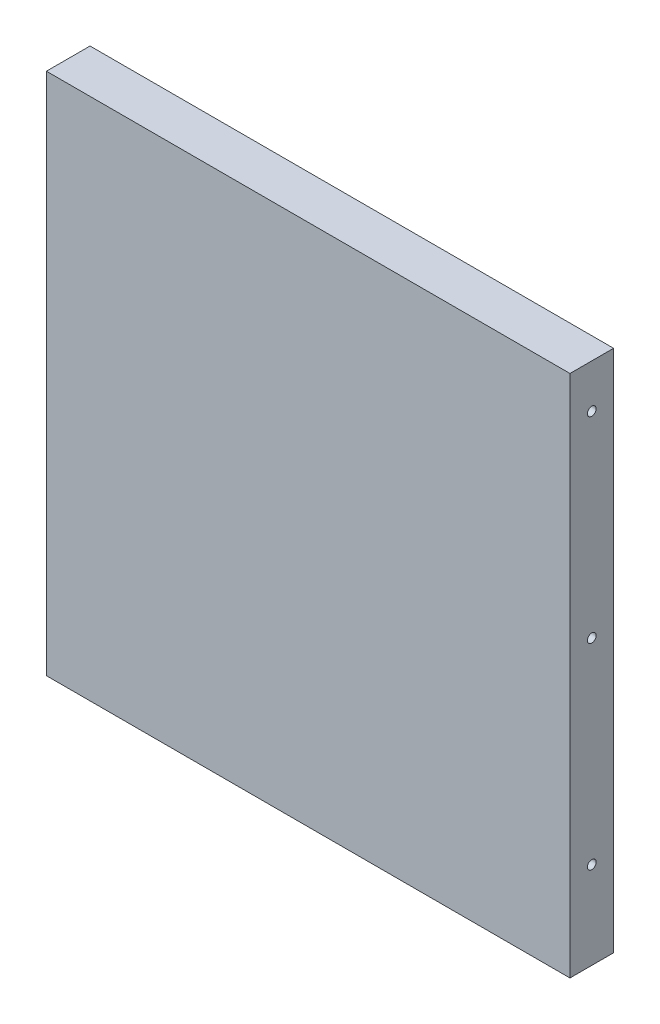
ISO-10303-21;
HEADER;
FILE_DESCRIPTION(('STEP AP214'),'2;1');
FILE_NAME('part.step','',(''),(''),'','','');
FILE_SCHEMA(('AUTOMOTIVE_DESIGN { 1 0 10303 214 1 1 1 1 }'));
ENDSEC;
DATA;
#1=APPLICATION_CONTEXT('core data for automotive mechanical design processes');
#2=APPLICATION_PROTOCOL_DEFINITION('international standard','automotive_design',2000,#1);
#3=PRODUCT_CONTEXT('',#1,'mechanical');
#4=PRODUCT('Part','Part','',(#3));
#5=PRODUCT_RELATED_PRODUCT_CATEGORY('part','',(#4));
#6=PRODUCT_DEFINITION_FORMATION('','',#4);
#7=PRODUCT_DEFINITION_CONTEXT('part definition',#1,'design');
#8=PRODUCT_DEFINITION('design','',#6,#7);
#9=PRODUCT_DEFINITION_SHAPE('','',#8);
#10=(LENGTH_UNIT() NAMED_UNIT(*) SI_UNIT(.MILLI.,.METRE.));
#11=(NAMED_UNIT(*) PLANE_ANGLE_UNIT() SI_UNIT($,.RADIAN.));
#12=(NAMED_UNIT(*) SI_UNIT($,.STERADIAN.) SOLID_ANGLE_UNIT());
#13=UNCERTAINTY_MEASURE_WITH_UNIT(LENGTH_MEASURE(1.E-05),#10,'distance_accuracy_value','');
#14=(GEOMETRIC_REPRESENTATION_CONTEXT(3) GLOBAL_UNCERTAINTY_ASSIGNED_CONTEXT((#13)) GLOBAL_UNIT_ASSIGNED_CONTEXT((#10,
#11,#12)) REPRESENTATION_CONTEXT('',''));
#15=CARTESIAN_POINT('',(0.,0.,0.));
#16=DIRECTION('',(0.,0.,1.));
#17=DIRECTION('',(1.,0.,0.));
#18=AXIS2_PLACEMENT_3D('',#15,#16,#17);
#19=CARTESIAN_POINT('',(152.4,152.4,12.7));
#20=DIRECTION('',(-1.,0.,0.));
#21=DIRECTION('',(0.,0.,1.));
#22=AXIS2_PLACEMENT_3D('',#19,#20,#21);
#23=PLANE('',#22);
#24=CARTESIAN_POINT('',(152.4,127.,0.));
#25=DIRECTION('',(1.,0.,0.));
#26=DIRECTION('',(0.,0.,-1.));
#27=AXIS2_PLACEMENT_3D('',#24,#25,#26);
#28=CIRCLE('',#27,2.55269999999999);
#29=CARTESIAN_POINT('',(152.4,127.,-2.55269999999996));
#30=VERTEX_POINT('',#29);
#31=EDGE_CURVE('E142',#30,#30,#28,.T.);
#32=ORIENTED_EDGE('',*,*,#31,.F.);
#33=EDGE_LOOP('',(#32));
#34=FACE_BOUND('',#33,.T.);
#35=CARTESIAN_POINT('',(152.4,12.7,0.));
#36=DIRECTION('',(1.,0.,0.));
#37=DIRECTION('',(0.,0.,-1.));
#38=AXIS2_PLACEMENT_3D('',#35,#36,#37);
#39=CIRCLE('',#38,2.55269999999999);
#40=CARTESIAN_POINT('',(152.4,12.7,-2.55269999999999));
#41=VERTEX_POINT('',#40);
#42=EDGE_CURVE('E150',#41,#41,#39,.T.);
#43=ORIENTED_EDGE('',*,*,#42,.F.);
#44=EDGE_LOOP('',(#43));
#45=FACE_BOUND('',#44,.T.);
#46=CARTESIAN_POINT('',(152.4,-101.6,0.));
#47=DIRECTION('',(1.,0.,0.));
#48=DIRECTION('',(0.,0.,-1.));
#49=AXIS2_PLACEMENT_3D('',#46,#47,#48);
#50=CIRCLE('',#49,2.55269999999999);
#51=CARTESIAN_POINT('',(152.4,-101.6,-2.55269999999999));
#52=VERTEX_POINT('',#51);
#53=EDGE_CURVE('E158',#52,#52,#50,.T.);
#54=ORIENTED_EDGE('',*,*,#53,.F.);
#55=EDGE_LOOP('',(#54));
#56=FACE_BOUND('',#55,.T.);
#57=DIRECTION('',(0.,0.,-1.));
#58=VECTOR('',#57,1.);
#59=CARTESIAN_POINT('',(152.4,-152.4,12.7));
#60=LINE('',#59,#58);
#61=CARTESIAN_POINT('',(152.4,-152.4,12.7));
#62=VERTEX_POINT('',#61);
#63=CARTESIAN_POINT('',(152.4,-152.4,-12.7));
#64=VERTEX_POINT('',#63);
#65=EDGE_CURVE('E166',#62,#64,#60,.T.);
#66=ORIENTED_EDGE('',*,*,#65,.T.);
#67=DIRECTION('',(0.,-1.,0.));
#68=VECTOR('',#67,1.);
#69=CARTESIAN_POINT('',(152.4,152.4,-12.7));
#70=LINE('',#69,#68);
#71=CARTESIAN_POINT('',(152.4,152.4,-12.7));
#72=VERTEX_POINT('',#71);
#73=EDGE_CURVE('E11',#72,#64,#70,.T.);
#74=ORIENTED_EDGE('',*,*,#73,.F.);
#75=DIRECTION('',(0.,0.,-1.));
#76=VECTOR('',#75,1.);
#77=CARTESIAN_POINT('',(152.4,152.4,12.7));
#78=LINE('',#77,#76);
#79=CARTESIAN_POINT('',(152.4,152.4,12.7));
#80=VERTEX_POINT('',#79);
#81=EDGE_CURVE('E167',#80,#72,#78,.T.);
#82=ORIENTED_EDGE('',*,*,#81,.F.);
#83=DIRECTION('',(0.,-1.,0.));
#84=VECTOR('',#83,1.);
#85=CARTESIAN_POINT('',(152.4,152.4,12.7));
#86=LINE('',#85,#84);
#87=EDGE_CURVE('E177',#80,#62,#86,.T.);
#88=ORIENTED_EDGE('',*,*,#87,.T.);
#89=EDGE_LOOP('',(#66,#74,#82,#88));
#90=FACE_BOUND('',#89,.T.);
#91=ADVANCED_FACE('F42',(#34,#45,#56,#90),#23,.F.);
#92=CARTESIAN_POINT('',(-152.4,152.4,-12.7));
#93=DIRECTION('',(0.,0.,1.));
#94=DIRECTION('',(1.,0.,0.));
#95=AXIS2_PLACEMENT_3D('',#92,#93,#94);
#96=PLANE('',#95);
#97=DIRECTION('',(-1.,0.,0.));
#98=VECTOR('',#97,1.);
#99=CARTESIAN_POINT('',(-152.4,-152.4,-12.7));
#100=LINE('',#99,#98);
#101=CARTESIAN_POINT('',(-152.4,-152.4,-12.7));
#102=VERTEX_POINT('',#101);
#103=EDGE_CURVE('E181',#64,#102,#100,.T.);
#104=ORIENTED_EDGE('',*,*,#103,.T.);
#105=DIRECTION('',(0.,-1.,0.));
#106=VECTOR('',#105,1.);
#107=CARTESIAN_POINT('',(-152.4,152.4,-12.7));
#108=LINE('',#107,#106);
#109=CARTESIAN_POINT('',(-152.4,152.4,-12.7));
#110=VERTEX_POINT('',#109);
#111=EDGE_CURVE('E51',#110,#102,#108,.T.);
#112=ORIENTED_EDGE('',*,*,#111,.F.);
#113=DIRECTION('',(-1.,0.,0.));
#114=VECTOR('',#113,1.);
#115=CARTESIAN_POINT('',(-152.4,152.4,-12.7));
#116=LINE('',#115,#114);
#117=EDGE_CURVE('E90',#72,#110,#116,.T.);
#118=ORIENTED_EDGE('',*,*,#117,.F.);
#119=ORIENTED_EDGE('',*,*,#73,.T.);
#120=EDGE_LOOP('',(#104,#112,#118,#119));
#121=FACE_BOUND('',#120,.T.);
#122=ADVANCED_FACE('F211',(#121),#96,.F.);
#123=CARTESIAN_POINT('',(-152.4,152.4,12.7));
#124=DIRECTION('',(1.,0.,0.));
#125=DIRECTION('',(0.,0.,-1.));
#126=AXIS2_PLACEMENT_3D('',#123,#124,#125);
#127=PLANE('',#126);
#128=CARTESIAN_POINT('',(-152.4,127.,0.));
#129=DIRECTION('',(-1.,0.,0.));
#130=DIRECTION('',(0.,0.,1.));
#131=AXIS2_PLACEMENT_3D('',#128,#129,#130);
#132=CIRCLE('',#131,2.55269999999999);
#133=CARTESIAN_POINT('',(-152.4,127.,2.55270000000002));
#134=VERTEX_POINT('',#133);
#135=EDGE_CURVE('E121',#134,#134,#132,.T.);
#136=ORIENTED_EDGE('',*,*,#135,.F.);
#137=EDGE_LOOP('',(#136));
#138=FACE_BOUND('',#137,.T.);
#139=CARTESIAN_POINT('',(-152.4,12.7,0.));
#140=DIRECTION('',(-1.,0.,0.));
#141=DIRECTION('',(0.,0.,1.));
#142=AXIS2_PLACEMENT_3D('',#139,#140,#141);
#143=CIRCLE('',#142,2.55269999999999);
#144=CARTESIAN_POINT('',(-152.4,12.7,2.55269999999999));
#145=VERTEX_POINT('',#144);
#146=EDGE_CURVE('E120',#145,#145,#143,.T.);
#147=ORIENTED_EDGE('',*,*,#146,.F.);
#148=EDGE_LOOP('',(#147));
#149=FACE_BOUND('',#148,.T.);
#150=CARTESIAN_POINT('',(-152.4,-101.6,0.));
#151=DIRECTION('',(-1.,0.,0.));
#152=DIRECTION('',(0.,0.,1.));
#153=AXIS2_PLACEMENT_3D('',#150,#151,#152);
#154=CIRCLE('',#153,2.55269999999999);
#155=CARTESIAN_POINT('',(-152.4,-101.6,2.55269999999999));
#156=VERTEX_POINT('',#155);
#157=EDGE_CURVE('E134',#156,#156,#154,.T.);
#158=ORIENTED_EDGE('',*,*,#157,.F.);
#159=EDGE_LOOP('',(#158));
#160=FACE_BOUND('',#159,.T.);
#161=DIRECTION('',(0.,0.,1.));
#162=VECTOR('',#161,1.);
#163=CARTESIAN_POINT('',(-152.4,-152.4,12.7));
#164=LINE('',#163,#162);
#165=CARTESIAN_POINT('',(-152.4,-152.4,12.7));
#166=VERTEX_POINT('',#165);
#167=EDGE_CURVE('E77',#102,#166,#164,.T.);
#168=ORIENTED_EDGE('',*,*,#167,.T.);
#169=DIRECTION('',(0.,-1.,0.));
#170=VECTOR('',#169,1.);
#171=CARTESIAN_POINT('',(-152.4,152.4,12.7));
#172=LINE('',#171,#170);
#173=CARTESIAN_POINT('',(-152.4,152.4,12.7));
#174=VERTEX_POINT('',#173);
#175=EDGE_CURVE('E190',#174,#166,#172,.T.);
#176=ORIENTED_EDGE('',*,*,#175,.F.);
#177=DIRECTION('',(0.,0.,1.));
#178=VECTOR('',#177,1.);
#179=CARTESIAN_POINT('',(-152.4,152.4,12.7));
#180=LINE('',#179,#178);
#181=EDGE_CURVE('E172',#110,#174,#180,.T.);
#182=ORIENTED_EDGE('',*,*,#181,.F.);
#183=ORIENTED_EDGE('',*,*,#111,.T.);
#184=EDGE_LOOP('',(#168,#176,#182,#183));
#185=FACE_BOUND('',#184,.T.);
#186=ADVANCED_FACE('F194',(#138,#149,#160,#185),#127,.F.);
#187=CARTESIAN_POINT('',(-152.4,152.4,12.7));
#188=DIRECTION('',(0.,0.,-1.));
#189=DIRECTION('',(-1.,0.,0.));
#190=AXIS2_PLACEMENT_3D('',#187,#188,#189);
#191=PLANE('',#190);
#192=DIRECTION('',(1.,0.,0.));
#193=VECTOR('',#192,1.);
#194=CARTESIAN_POINT('',(-152.4,-152.4,12.7));
#195=LINE('',#194,#193);
#196=EDGE_CURVE('E83',#166,#62,#195,.T.);
#197=ORIENTED_EDGE('',*,*,#196,.T.);
#198=ORIENTED_EDGE('',*,*,#87,.F.);
#199=DIRECTION('',(1.,0.,0.));
#200=VECTOR('',#199,1.);
#201=CARTESIAN_POINT('',(-152.4,152.4,12.7));
#202=LINE('',#201,#200);
#203=EDGE_CURVE('E59',#174,#80,#202,.T.);
#204=ORIENTED_EDGE('',*,*,#203,.F.);
#205=ORIENTED_EDGE('',*,*,#175,.T.);
#206=EDGE_LOOP('',(#197,#198,#204,#205));
#207=FACE_BOUND('',#206,.T.);
#208=ADVANCED_FACE('F201',(#207),#191,.F.);
#209=CARTESIAN_POINT('',(0.,152.4,0.));
#210=DIRECTION('',(0.,-1.,0.));
#211=DIRECTION('',(0.,0.,-1.));
#212=AXIS2_PLACEMENT_3D('',#209,#210,#211);
#213=PLANE('',#212);
#214=ORIENTED_EDGE('',*,*,#81,.T.);
#215=ORIENTED_EDGE('',*,*,#117,.T.);
#216=ORIENTED_EDGE('',*,*,#181,.T.);
#217=ORIENTED_EDGE('',*,*,#203,.T.);
#218=EDGE_LOOP('',(#214,#215,#216,#217));
#219=FACE_BOUND('',#218,.T.);
#220=ADVANCED_FACE('F203',(#219),#213,.F.);
#221=CARTESIAN_POINT('',(0.,-152.4,0.));
#222=DIRECTION('',(0.,-1.,0.));
#223=DIRECTION('',(0.,0.,-1.));
#224=AXIS2_PLACEMENT_3D('',#221,#222,#223);
#225=PLANE('',#224);
#226=ORIENTED_EDGE('',*,*,#65,.F.);
#227=ORIENTED_EDGE('',*,*,#196,.F.);
#228=ORIENTED_EDGE('',*,*,#167,.F.);
#229=ORIENTED_EDGE('',*,*,#103,.F.);
#230=EDGE_LOOP('',(#226,#227,#228,#229));
#231=FACE_BOUND('',#230,.T.);
#232=ADVANCED_FACE('F197',(#231),#225,.T.);
#233=CARTESIAN_POINT('',(123.19,-101.6,0.));
#234=DIRECTION('',(1.,0.,0.));
#235=DIRECTION('',(0.,0.,-1.));
#236=AXIS2_PLACEMENT_3D('',#233,#234,#235);
#237=CONICAL_SURFACE('',#236,2.55269999999996,1.02974425867665);
#238=CARTESIAN_POINT('',(121.656183097808,-101.6,0.));
#239=VERTEX_POINT('',#238);
#240=VERTEX_LOOP('',#239);
#241=FACE_BOUND('',#240,.T.);
#242=CARTESIAN_POINT('',(123.19,-101.6,0.));
#243=DIRECTION('',(1.,0.,0.));
#244=DIRECTION('',(0.,0.,-1.));
#245=AXIS2_PLACEMENT_3D('',#242,#243,#244);
#246=CIRCLE('',#245,2.55269999999996);
#247=CARTESIAN_POINT('',(123.19,-101.6,-2.55269999999996));
#248=VERTEX_POINT('',#247);
#249=EDGE_CURVE('E162',#248,#248,#246,.T.);
#250=ORIENTED_EDGE('',*,*,#249,.T.);
#251=EDGE_LOOP('',(#250));
#252=FACE_BOUND('',#251,.T.);
#253=ADVANCED_FACE('F230',(#241,#252),#237,.F.);
#254=CARTESIAN_POINT('',(152.4,-101.6,0.));
#255=DIRECTION('',(1.,0.,0.));
#256=DIRECTION('',(0.,0.,-1.));
#257=AXIS2_PLACEMENT_3D('',#254,#255,#256);
#258=CYLINDRICAL_SURFACE('',#257,2.55269999999998);
#259=ORIENTED_EDGE('',*,*,#249,.F.);
#260=EDGE_LOOP('',(#259));
#261=FACE_BOUND('',#260,.T.);
#262=ORIENTED_EDGE('',*,*,#53,.T.);
#263=EDGE_LOOP('',(#262));
#264=FACE_BOUND('',#263,.T.);
#265=ADVANCED_FACE('F227',(#261,#264),#258,.F.);
#266=CARTESIAN_POINT('',(123.19,12.7,0.));
#267=DIRECTION('',(1.,0.,0.));
#268=DIRECTION('',(0.,0.,-1.));
#269=AXIS2_PLACEMENT_3D('',#266,#267,#268);
#270=CONICAL_SURFACE('',#269,2.55269999999996,1.02974425867665);
#271=CARTESIAN_POINT('',(121.656183097808,12.7,0.));
#272=VERTEX_POINT('',#271);
#273=VERTEX_LOOP('',#272);
#274=FACE_BOUND('',#273,.T.);
#275=CARTESIAN_POINT('',(123.19,12.7,0.));
#276=DIRECTION('',(1.,0.,0.));
#277=DIRECTION('',(0.,0.,-1.));
#278=AXIS2_PLACEMENT_3D('',#275,#276,#277);
#279=CIRCLE('',#278,2.55269999999996);
#280=CARTESIAN_POINT('',(123.19,12.7,-2.55269999999996));
#281=VERTEX_POINT('',#280);
#282=EDGE_CURVE('E154',#281,#281,#279,.T.);
#283=ORIENTED_EDGE('',*,*,#282,.T.);
#284=EDGE_LOOP('',(#283));
#285=FACE_BOUND('',#284,.T.);
#286=ADVANCED_FACE('F229',(#274,#285),#270,.F.);
#287=CARTESIAN_POINT('',(152.4,12.7,0.));
#288=DIRECTION('',(1.,0.,0.));
#289=DIRECTION('',(0.,0.,-1.));
#290=AXIS2_PLACEMENT_3D('',#287,#288,#289);
#291=CYLINDRICAL_SURFACE('',#290,2.55269999999997);
#292=ORIENTED_EDGE('',*,*,#282,.F.);
#293=EDGE_LOOP('',(#292));
#294=FACE_BOUND('',#293,.T.);
#295=ORIENTED_EDGE('',*,*,#42,.T.);
#296=EDGE_LOOP('',(#295));
#297=FACE_BOUND('',#296,.T.);
#298=ADVANCED_FACE('F236',(#294,#297),#291,.F.);
#299=CARTESIAN_POINT('',(123.19,127.,0.));
#300=DIRECTION('',(1.,0.,0.));
#301=DIRECTION('',(0.,0.,-1.));
#302=AXIS2_PLACEMENT_3D('',#299,#300,#301);
#303=CONICAL_SURFACE('',#302,2.55269999999996,1.02974425867665);
#304=CARTESIAN_POINT('',(121.656183097808,127.,0.));
#305=VERTEX_POINT('',#304);
#306=VERTEX_LOOP('',#305);
#307=FACE_BOUND('',#306,.T.);
#308=CARTESIAN_POINT('',(123.19,127.,0.));
#309=DIRECTION('',(1.,0.,0.));
#310=DIRECTION('',(0.,0.,-1.));
#311=AXIS2_PLACEMENT_3D('',#308,#309,#310);
#312=CIRCLE('',#311,2.55269999999996);
#313=CARTESIAN_POINT('',(123.19,127.,-2.55269999999994));
#314=VERTEX_POINT('',#313);
#315=EDGE_CURVE('E146',#314,#314,#312,.T.);
#316=ORIENTED_EDGE('',*,*,#315,.T.);
#317=EDGE_LOOP('',(#316));
#318=FACE_BOUND('',#317,.T.);
#319=ADVANCED_FACE('F280',(#307,#318),#303,.F.);
#320=CARTESIAN_POINT('',(152.4,127.,0.));
#321=DIRECTION('',(1.,0.,0.));
#322=DIRECTION('',(0.,0.,-1.));
#323=AXIS2_PLACEMENT_3D('',#320,#321,#322);
#324=CYLINDRICAL_SURFACE('',#323,2.55269999999998);
#325=ORIENTED_EDGE('',*,*,#315,.F.);
#326=EDGE_LOOP('',(#325));
#327=FACE_BOUND('',#326,.T.);
#328=ORIENTED_EDGE('',*,*,#31,.T.);
#329=EDGE_LOOP('',(#328));
#330=FACE_BOUND('',#329,.T.);
#331=ADVANCED_FACE('F291',(#327,#330),#324,.F.);
#332=CARTESIAN_POINT('',(-123.19,-101.6,0.));
#333=DIRECTION('',(-1.,0.,0.));
#334=DIRECTION('',(0.,0.,1.));
#335=AXIS2_PLACEMENT_3D('',#332,#333,#334);
#336=CONICAL_SURFACE('',#335,2.55269999999996,1.02974425867665);
#337=CARTESIAN_POINT('',(-121.656183097808,-101.6,0.));
#338=VERTEX_POINT('',#337);
#339=VERTEX_LOOP('',#338);
#340=FACE_BOUND('',#339,.T.);
#341=CARTESIAN_POINT('',(-123.19,-101.6,0.));
#342=DIRECTION('',(-1.,0.,0.));
#343=DIRECTION('',(0.,0.,1.));
#344=AXIS2_PLACEMENT_3D('',#341,#342,#343);
#345=CIRCLE('',#344,2.55269999999996);
#346=CARTESIAN_POINT('',(-123.19,-101.6,2.55269999999996));
#347=VERTEX_POINT('',#346);
#348=EDGE_CURVE('E138',#347,#347,#345,.T.);
#349=ORIENTED_EDGE('',*,*,#348,.T.);
#350=EDGE_LOOP('',(#349));
#351=FACE_BOUND('',#350,.T.);
#352=ADVANCED_FACE('F301',(#340,#351),#336,.F.);
#353=CARTESIAN_POINT('',(-152.4,-101.6,0.));
#354=DIRECTION('',(-1.,0.,0.));
#355=DIRECTION('',(0.,0.,1.));
#356=AXIS2_PLACEMENT_3D('',#353,#354,#355);
#357=CYLINDRICAL_SURFACE('',#356,2.55269999999998);
#358=ORIENTED_EDGE('',*,*,#348,.F.);
#359=EDGE_LOOP('',(#358));
#360=FACE_BOUND('',#359,.T.);
#361=ORIENTED_EDGE('',*,*,#157,.T.);
#362=EDGE_LOOP('',(#361));
#363=FACE_BOUND('',#362,.T.);
#364=ADVANCED_FACE('F321',(#360,#363),#357,.F.);
#365=CARTESIAN_POINT('',(-123.19,12.7,0.));
#366=DIRECTION('',(-1.,0.,0.));
#367=DIRECTION('',(0.,0.,1.));
#368=AXIS2_PLACEMENT_3D('',#365,#366,#367);
#369=CONICAL_SURFACE('',#368,2.55269999999996,1.02974425867665);
#370=CARTESIAN_POINT('',(-121.656183097808,12.7,0.));
#371=VERTEX_POINT('',#370);
#372=VERTEX_LOOP('',#371);
#373=FACE_BOUND('',#372,.T.);
#374=CARTESIAN_POINT('',(-123.19,12.7,0.));
#375=DIRECTION('',(-1.,0.,0.));
#376=DIRECTION('',(0.,0.,1.));
#377=AXIS2_PLACEMENT_3D('',#374,#375,#376);
#378=CIRCLE('',#377,2.55269999999996);
#379=CARTESIAN_POINT('',(-123.19,12.7,2.55269999999996));
#380=VERTEX_POINT('',#379);
#381=EDGE_CURVE('E126',#380,#380,#378,.T.);
#382=ORIENTED_EDGE('',*,*,#381,.T.);
#383=EDGE_LOOP('',(#382));
#384=FACE_BOUND('',#383,.T.);
#385=ADVANCED_FACE('F332',(#373,#384),#369,.F.);
#386=CARTESIAN_POINT('',(-152.4,12.7,0.));
#387=DIRECTION('',(-1.,0.,0.));
#388=DIRECTION('',(0.,0.,1.));
#389=AXIS2_PLACEMENT_3D('',#386,#387,#388);
#390=CYLINDRICAL_SURFACE('',#389,2.55269999999997);
#391=ORIENTED_EDGE('',*,*,#381,.F.);
#392=EDGE_LOOP('',(#391));
#393=FACE_BOUND('',#392,.T.);
#394=ORIENTED_EDGE('',*,*,#146,.T.);
#395=EDGE_LOOP('',(#394));
#396=FACE_BOUND('',#395,.T.);
#397=ADVANCED_FACE('F113',(#393,#396),#390,.F.);
#398=CARTESIAN_POINT('',(-123.19,127.,0.));
#399=DIRECTION('',(-1.,0.,0.));
#400=DIRECTION('',(0.,0.,1.));
#401=AXIS2_PLACEMENT_3D('',#398,#399,#400);
#402=CONICAL_SURFACE('',#401,2.55269999999996,1.02974425867665);
#403=CARTESIAN_POINT('',(-121.656183097808,127.,0.));
#404=VERTEX_POINT('',#403);
#405=VERTEX_LOOP('',#404);
#406=FACE_BOUND('',#405,.T.);
#407=CARTESIAN_POINT('',(-123.19,127.,0.));
#408=DIRECTION('',(-1.,0.,0.));
#409=DIRECTION('',(0.,0.,1.));
#410=AXIS2_PLACEMENT_3D('',#407,#408,#409);
#411=CIRCLE('',#410,2.55269999999996);
#412=CARTESIAN_POINT('',(-123.19,127.,2.55269999999999));
#413=VERTEX_POINT('',#412);
#414=EDGE_CURVE('E117',#413,#413,#411,.T.);
#415=ORIENTED_EDGE('',*,*,#414,.T.);
#416=EDGE_LOOP('',(#415));
#417=FACE_BOUND('',#416,.T.);
#418=ADVANCED_FACE('F109',(#406,#417),#402,.F.);
#419=CARTESIAN_POINT('',(-152.4,127.,0.));
#420=DIRECTION('',(-1.,0.,0.));
#421=DIRECTION('',(0.,0.,1.));
#422=AXIS2_PLACEMENT_3D('',#419,#420,#421);
#423=CYLINDRICAL_SURFACE('',#422,2.55269999999998);
#424=ORIENTED_EDGE('',*,*,#414,.F.);
#425=EDGE_LOOP('',(#424));
#426=FACE_BOUND('',#425,.T.);
#427=ORIENTED_EDGE('',*,*,#135,.T.);
#428=EDGE_LOOP('',(#427));
#429=FACE_BOUND('',#428,.T.);
#430=ADVANCED_FACE('F112',(#426,#429),#423,.F.);
#431=CLOSED_SHELL('',(#91,#122,#186,#208,#220,#232,#253,#265,#286,#298,#319,#331,#352,#364,#385,
#397,#418,#430));
#432=MANIFOLD_SOLID_BREP('B2',#431);
#433=ADVANCED_BREP_SHAPE_REPRESENTATION('',(#18,#432),#14);
#434=SHAPE_DEFINITION_REPRESENTATION(#9,#433);
ENDSEC;
END-ISO-10303-21;
